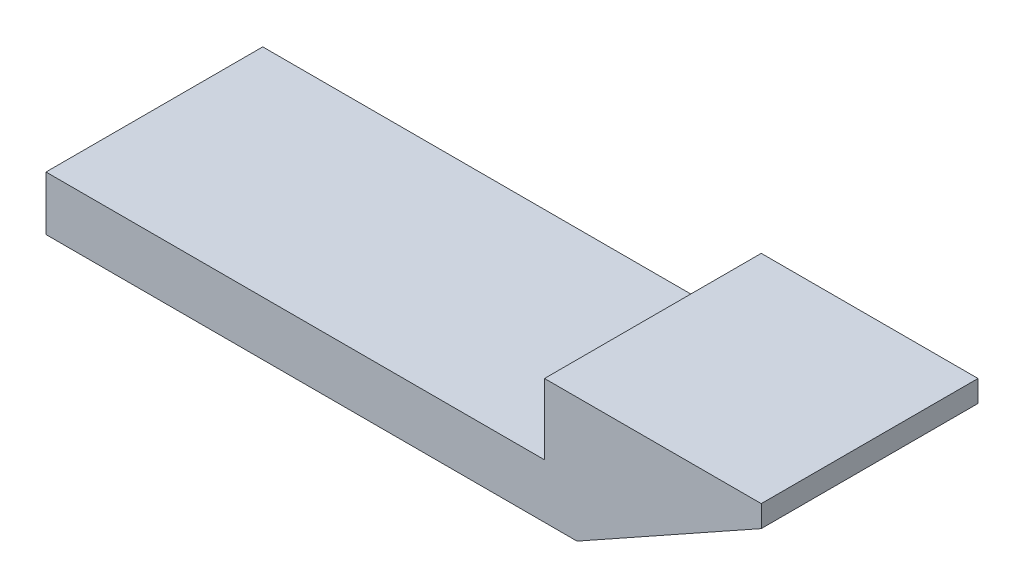
ISO-10303-21;
HEADER;
FILE_DESCRIPTION(('STEP AP214'),'2;1');
FILE_NAME('part.step','',(''),(''),'','','');
FILE_SCHEMA(('AUTOMOTIVE_DESIGN { 1 0 10303 214 1 1 1 1 }'));
ENDSEC;
DATA;
#1=APPLICATION_CONTEXT('core data for automotive mechanical design processes');
#2=APPLICATION_PROTOCOL_DEFINITION('international standard','automotive_design',2000,#1);
#3=PRODUCT_CONTEXT('',#1,'mechanical');
#4=PRODUCT('Part','Part','',(#3));
#5=PRODUCT_RELATED_PRODUCT_CATEGORY('part','',(#4));
#6=PRODUCT_DEFINITION_FORMATION('','',#4);
#7=PRODUCT_DEFINITION_CONTEXT('part definition',#1,'design');
#8=PRODUCT_DEFINITION('design','',#6,#7);
#9=PRODUCT_DEFINITION_SHAPE('','',#8);
#10=(LENGTH_UNIT() NAMED_UNIT(*) SI_UNIT(.MILLI.,.METRE.));
#11=(NAMED_UNIT(*) PLANE_ANGLE_UNIT() SI_UNIT($,.RADIAN.));
#12=(NAMED_UNIT(*) SI_UNIT($,.STERADIAN.) SOLID_ANGLE_UNIT());
#13=UNCERTAINTY_MEASURE_WITH_UNIT(LENGTH_MEASURE(1.E-05),#10,'distance_accuracy_value','');
#14=(GEOMETRIC_REPRESENTATION_CONTEXT(3) GLOBAL_UNCERTAINTY_ASSIGNED_CONTEXT((#13)) GLOBAL_UNIT_ASSIGNED_CONTEXT((#10,
#11,#12)) REPRESENTATION_CONTEXT('',''));
#15=CARTESIAN_POINT('',(0.,0.,0.));
#16=DIRECTION('',(0.,0.,1.));
#17=DIRECTION('',(1.,0.,0.));
#18=AXIS2_PLACEMENT_3D('',#15,#16,#17);
#19=CARTESIAN_POINT('',(-17.0862179798015,0.54054054054054,20.));
#20=DIRECTION('',(1.,0.,0.));
#21=DIRECTION('',(0.,1.,0.));
#22=AXIS2_PLACEMENT_3D('',#19,#20,#21);
#23=PLANE('',#22);
#24=DIRECTION('',(0.,-1.,0.));
#25=VECTOR('',#24,1.);
#26=CARTESIAN_POINT('',(-17.0862179798015,0.54054054054054,0.));
#27=LINE('',#26,#25);
#28=CARTESIAN_POINT('',(-17.0862179798015,0.54054054054054,0.));
#29=VERTEX_POINT('',#28);
#30=CARTESIAN_POINT('',(-17.0862179798015,-4.45945945945946,0.));
#31=VERTEX_POINT('',#30);
#32=EDGE_CURVE('E134',#29,#31,#27,.T.);
#33=ORIENTED_EDGE('',*,*,#32,.T.);
#34=DIRECTION('',(0.,0.,-1.));
#35=VECTOR('',#34,1.);
#36=CARTESIAN_POINT('',(-17.0862179798015,-4.45945945945946,20.));
#37=LINE('',#36,#35);
#38=CARTESIAN_POINT('',(-17.0862179798015,-4.45945945945946,20.));
#39=VERTEX_POINT('',#38);
#40=EDGE_CURVE('E11',#39,#31,#37,.T.);
#41=ORIENTED_EDGE('',*,*,#40,.F.);
#42=DIRECTION('',(0.,-1.,0.));
#43=VECTOR('',#42,1.);
#44=CARTESIAN_POINT('',(-17.0862179798015,0.54054054054054,20.));
#45=LINE('',#44,#43);
#46=CARTESIAN_POINT('',(-17.0862179798015,0.54054054054054,20.));
#47=VERTEX_POINT('',#46);
#48=EDGE_CURVE('E153',#47,#39,#45,.T.);
#49=ORIENTED_EDGE('',*,*,#48,.F.);
#50=DIRECTION('',(0.,0.,-1.));
#51=VECTOR('',#50,1.);
#52=CARTESIAN_POINT('',(-17.0862179798015,0.54054054054054,20.));
#53=LINE('',#52,#51);
#54=EDGE_CURVE('E130',#47,#29,#53,.T.);
#55=ORIENTED_EDGE('',*,*,#54,.T.);
#56=EDGE_LOOP('',(#33,#41,#49,#55));
#57=FACE_BOUND('',#56,.T.);
#58=ADVANCED_FACE('F39',(#57),#23,.F.);
#59=CARTESIAN_POINT('',(-17.0862179798015,-4.45945945945946,20.));
#60=DIRECTION('',(0.,1.,0.));
#61=DIRECTION('',(0.,0.,1.));
#62=AXIS2_PLACEMENT_3D('',#59,#60,#61);
#63=PLANE('',#62);
#64=DIRECTION('',(1.,0.,0.));
#65=VECTOR('',#64,1.);
#66=CARTESIAN_POINT('',(-17.0862179798015,-4.45945945945946,0.));
#67=LINE('',#66,#65);
#68=CARTESIAN_POINT('',(31.9137820201985,-4.45945945945946,0.));
#69=VERTEX_POINT('',#68);
#70=EDGE_CURVE('E138',#31,#69,#67,.T.);
#71=ORIENTED_EDGE('',*,*,#70,.T.);
#72=DIRECTION('',(0.,0.,-1.));
#73=VECTOR('',#72,1.);
#74=CARTESIAN_POINT('',(31.9137820201985,-4.45945945945946,20.));
#75=LINE('',#74,#73);
#76=CARTESIAN_POINT('',(31.9137820201985,-4.45945945945946,20.));
#77=VERTEX_POINT('',#76);
#78=EDGE_CURVE('E48',#77,#69,#75,.T.);
#79=ORIENTED_EDGE('',*,*,#78,.F.);
#80=DIRECTION('',(1.,0.,0.));
#81=VECTOR('',#80,1.);
#82=CARTESIAN_POINT('',(-17.0862179798015,-4.45945945945946,20.));
#83=LINE('',#82,#81);
#84=EDGE_CURVE('E96',#39,#77,#83,.T.);
#85=ORIENTED_EDGE('',*,*,#84,.F.);
#86=ORIENTED_EDGE('',*,*,#40,.T.);
#87=EDGE_LOOP('',(#71,#79,#85,#86));
#88=FACE_BOUND('',#87,.T.);
#89=ADVANCED_FACE('F187',(#88),#63,.F.);
#90=CARTESIAN_POINT('',(48.9137820201985,5.04054054054054,20.));
#91=DIRECTION('',(-0.487821357664942,0.872943482137265,0.));
#92=DIRECTION('',(-0.872943482137264,-0.487821357664942,0.));
#93=AXIS2_PLACEMENT_3D('',#90,#91,#92);
#94=PLANE('',#93);
#95=DIRECTION('',(0.872943482137265,0.487821357664942,0.));
#96=VECTOR('',#95,1.);
#97=CARTESIAN_POINT('',(48.9137820201985,5.04054054054054,0.));
#98=LINE('',#97,#96);
#99=CARTESIAN_POINT('',(48.9137820201985,5.04054054054054,0.));
#100=VERTEX_POINT('',#99);
#101=EDGE_CURVE('E141',#69,#100,#98,.T.);
#102=ORIENTED_EDGE('',*,*,#101,.T.);
#103=DIRECTION('',(0.,0.,-1.));
#104=VECTOR('',#103,1.);
#105=CARTESIAN_POINT('',(48.9137820201985,5.04054054054054,20.));
#106=LINE('',#105,#104);
#107=CARTESIAN_POINT('',(48.9137820201985,5.04054054054054,20.));
#108=VERTEX_POINT('',#107);
#109=EDGE_CURVE('E160',#108,#100,#106,.T.);
#110=ORIENTED_EDGE('',*,*,#109,.F.);
#111=DIRECTION('',(0.872943482137265,0.487821357664942,0.));
#112=VECTOR('',#111,1.);
#113=CARTESIAN_POINT('',(48.9137820201985,5.04054054054054,20.));
#114=LINE('',#113,#112);
#115=EDGE_CURVE('E170',#77,#108,#114,.T.);
#116=ORIENTED_EDGE('',*,*,#115,.F.);
#117=ORIENTED_EDGE('',*,*,#78,.T.);
#118=EDGE_LOOP('',(#102,#110,#116,#117));
#119=FACE_BOUND('',#118,.T.);
#120=ADVANCED_FACE('F168',(#119),#94,.F.);
#121=CARTESIAN_POINT('',(48.9137820201985,7.04054054054054,20.));
#122=DIRECTION('',(-1.,0.,0.));
#123=DIRECTION('',(0.,0.,1.));
#124=AXIS2_PLACEMENT_3D('',#121,#122,#123);
#125=PLANE('',#124);
#126=DIRECTION('',(0.,1.,0.));
#127=VECTOR('',#126,1.);
#128=CARTESIAN_POINT('',(48.9137820201985,7.04054054054054,0.));
#129=LINE('',#128,#127);
#130=CARTESIAN_POINT('',(48.9137820201985,7.04054054054054,0.));
#131=VERTEX_POINT('',#130);
#132=EDGE_CURVE('E144',#100,#131,#129,.T.);
#133=ORIENTED_EDGE('',*,*,#132,.T.);
#134=DIRECTION('',(0.,0.,-1.));
#135=VECTOR('',#134,1.);
#136=CARTESIAN_POINT('',(48.9137820201985,7.04054054054054,20.));
#137=LINE('',#136,#135);
#138=CARTESIAN_POINT('',(48.9137820201985,7.04054054054054,20.));
#139=VERTEX_POINT('',#138);
#140=EDGE_CURVE('E123',#139,#131,#137,.T.);
#141=ORIENTED_EDGE('',*,*,#140,.F.);
#142=DIRECTION('',(0.,1.,0.));
#143=VECTOR('',#142,1.);
#144=CARTESIAN_POINT('',(48.9137820201985,7.04054054054054,20.));
#145=LINE('',#144,#143);
#146=EDGE_CURVE('E112',#108,#139,#145,.T.);
#147=ORIENTED_EDGE('',*,*,#146,.F.);
#148=ORIENTED_EDGE('',*,*,#109,.T.);
#149=EDGE_LOOP('',(#133,#141,#147,#148));
#150=FACE_BOUND('',#149,.T.);
#151=ADVANCED_FACE('F176',(#150),#125,.F.);
#152=CARTESIAN_POINT('',(28.9137820201985,7.04054054054054,20.));
#153=DIRECTION('',(0.,-1.,0.));
#154=DIRECTION('',(0.,0.,-1.));
#155=AXIS2_PLACEMENT_3D('',#152,#153,#154);
#156=PLANE('',#155);
#157=DIRECTION('',(-1.,0.,0.));
#158=VECTOR('',#157,1.);
#159=CARTESIAN_POINT('',(28.9137820201985,7.04054054054054,0.));
#160=LINE('',#159,#158);
#161=CARTESIAN_POINT('',(28.9137820201985,7.04054054054054,0.));
#162=VERTEX_POINT('',#161);
#163=EDGE_CURVE('E121',#131,#162,#160,.T.);
#164=ORIENTED_EDGE('',*,*,#163,.T.);
#165=DIRECTION('',(0.,0.,-1.));
#166=VECTOR('',#165,1.);
#167=CARTESIAN_POINT('',(28.9137820201985,7.04054054054054,20.));
#168=LINE('',#167,#166);
#169=CARTESIAN_POINT('',(28.9137820201985,7.04054054054054,20.));
#170=VERTEX_POINT('',#169);
#171=EDGE_CURVE('E118',#170,#162,#168,.T.);
#172=ORIENTED_EDGE('',*,*,#171,.F.);
#173=DIRECTION('',(-1.,0.,0.));
#174=VECTOR('',#173,1.);
#175=CARTESIAN_POINT('',(28.9137820201985,7.04054054054054,20.));
#176=LINE('',#175,#174);
#177=EDGE_CURVE('E106',#139,#170,#176,.T.);
#178=ORIENTED_EDGE('',*,*,#177,.F.);
#179=ORIENTED_EDGE('',*,*,#140,.T.);
#180=EDGE_LOOP('',(#164,#172,#178,#179));
#181=FACE_BOUND('',#180,.T.);
#182=ADVANCED_FACE('F119',(#181),#156,.F.);
#183=CARTESIAN_POINT('',(28.9137820201985,0.54054054054054,20.));
#184=DIRECTION('',(1.,0.,0.));
#185=DIRECTION('',(0.,0.,-1.));
#186=AXIS2_PLACEMENT_3D('',#183,#184,#185);
#187=PLANE('',#186);
#188=DIRECTION('',(0.,-1.,0.));
#189=VECTOR('',#188,1.);
#190=CARTESIAN_POINT('',(28.9137820201985,0.54054054054054,0.));
#191=LINE('',#190,#189);
#192=CARTESIAN_POINT('',(28.9137820201985,0.54054054054054,0.));
#193=VERTEX_POINT('',#192);
#194=EDGE_CURVE('E82',#162,#193,#191,.T.);
#195=ORIENTED_EDGE('',*,*,#194,.T.);
#196=DIRECTION('',(0.,0.,-1.));
#197=VECTOR('',#196,1.);
#198=CARTESIAN_POINT('',(28.9137820201985,0.54054054054054,20.));
#199=LINE('',#198,#197);
#200=CARTESIAN_POINT('',(28.9137820201985,0.54054054054054,20.));
#201=VERTEX_POINT('',#200);
#202=EDGE_CURVE('E124',#201,#193,#199,.T.);
#203=ORIENTED_EDGE('',*,*,#202,.F.);
#204=DIRECTION('',(0.,-1.,0.));
#205=VECTOR('',#204,1.);
#206=CARTESIAN_POINT('',(28.9137820201985,0.54054054054054,20.));
#207=LINE('',#206,#205);
#208=EDGE_CURVE('E110',#170,#201,#207,.T.);
#209=ORIENTED_EDGE('',*,*,#208,.F.);
#210=ORIENTED_EDGE('',*,*,#171,.T.);
#211=EDGE_LOOP('',(#195,#203,#209,#210));
#212=FACE_BOUND('',#211,.T.);
#213=ADVANCED_FACE('F126',(#212),#187,.F.);
#214=CARTESIAN_POINT('',(-17.0862179798015,0.54054054054054,20.));
#215=DIRECTION('',(0.,-1.,0.));
#216=DIRECTION('',(0.,0.,-1.));
#217=AXIS2_PLACEMENT_3D('',#214,#215,#216);
#218=PLANE('',#217);
#219=DIRECTION('',(-1.,0.,0.));
#220=VECTOR('',#219,1.);
#221=CARTESIAN_POINT('',(-17.0862179798015,0.54054054054054,0.));
#222=LINE('',#221,#220);
#223=EDGE_CURVE('E88',#193,#29,#222,.T.);
#224=ORIENTED_EDGE('',*,*,#223,.T.);
#225=ORIENTED_EDGE('',*,*,#54,.F.);
#226=DIRECTION('',(-1.,0.,0.));
#227=VECTOR('',#226,1.);
#228=CARTESIAN_POINT('',(-17.0862179798015,0.54054054054054,20.));
#229=LINE('',#228,#227);
#230=EDGE_CURVE('E56',#201,#47,#229,.T.);
#231=ORIENTED_EDGE('',*,*,#230,.F.);
#232=ORIENTED_EDGE('',*,*,#202,.T.);
#233=EDGE_LOOP('',(#224,#225,#231,#232));
#234=FACE_BOUND('',#233,.T.);
#235=ADVANCED_FACE('F201',(#234),#218,.F.);
#236=CARTESIAN_POINT('',(0.,0.,20.));
#237=DIRECTION('',(0.,0.,1.));
#238=DIRECTION('',(1.,0.,0.));
#239=AXIS2_PLACEMENT_3D('',#236,#237,#238);
#240=PLANE('',#239);
#241=ORIENTED_EDGE('',*,*,#48,.T.);
#242=ORIENTED_EDGE('',*,*,#84,.T.);
#243=ORIENTED_EDGE('',*,*,#115,.T.);
#244=ORIENTED_EDGE('',*,*,#146,.T.);
#245=ORIENTED_EDGE('',*,*,#177,.T.);
#246=ORIENTED_EDGE('',*,*,#208,.T.);
#247=ORIENTED_EDGE('',*,*,#230,.T.);
#248=EDGE_LOOP('',(#241,#242,#243,#244,#245,#246,#247));
#249=FACE_BOUND('',#248,.T.);
#250=ADVANCED_FACE('F108',(#249),#240,.T.);
#251=CARTESIAN_POINT('',(0.,0.,0.));
#252=DIRECTION('',(0.,0.,1.));
#253=DIRECTION('',(1.,0.,0.));
#254=AXIS2_PLACEMENT_3D('',#251,#252,#253);
#255=PLANE('',#254);
#256=ORIENTED_EDGE('',*,*,#32,.F.);
#257=ORIENTED_EDGE('',*,*,#223,.F.);
#258=ORIENTED_EDGE('',*,*,#194,.F.);
#259=ORIENTED_EDGE('',*,*,#163,.F.);
#260=ORIENTED_EDGE('',*,*,#132,.F.);
#261=ORIENTED_EDGE('',*,*,#101,.F.);
#262=ORIENTED_EDGE('',*,*,#70,.F.);
#263=EDGE_LOOP('',(#256,#257,#258,#259,#260,#261,#262));
#264=FACE_BOUND('',#263,.T.);
#265=ADVANCED_FACE('F174',(#264),#255,.F.);
#266=CLOSED_SHELL('',(#58,#89,#120,#151,#182,#213,#235,#250,#265));
#267=MANIFOLD_SOLID_BREP('B2',#266);
#268=ADVANCED_BREP_SHAPE_REPRESENTATION('',(#18,#267),#14);
#269=SHAPE_DEFINITION_REPRESENTATION(#9,#268);
ENDSEC;
END-ISO-10303-21;
